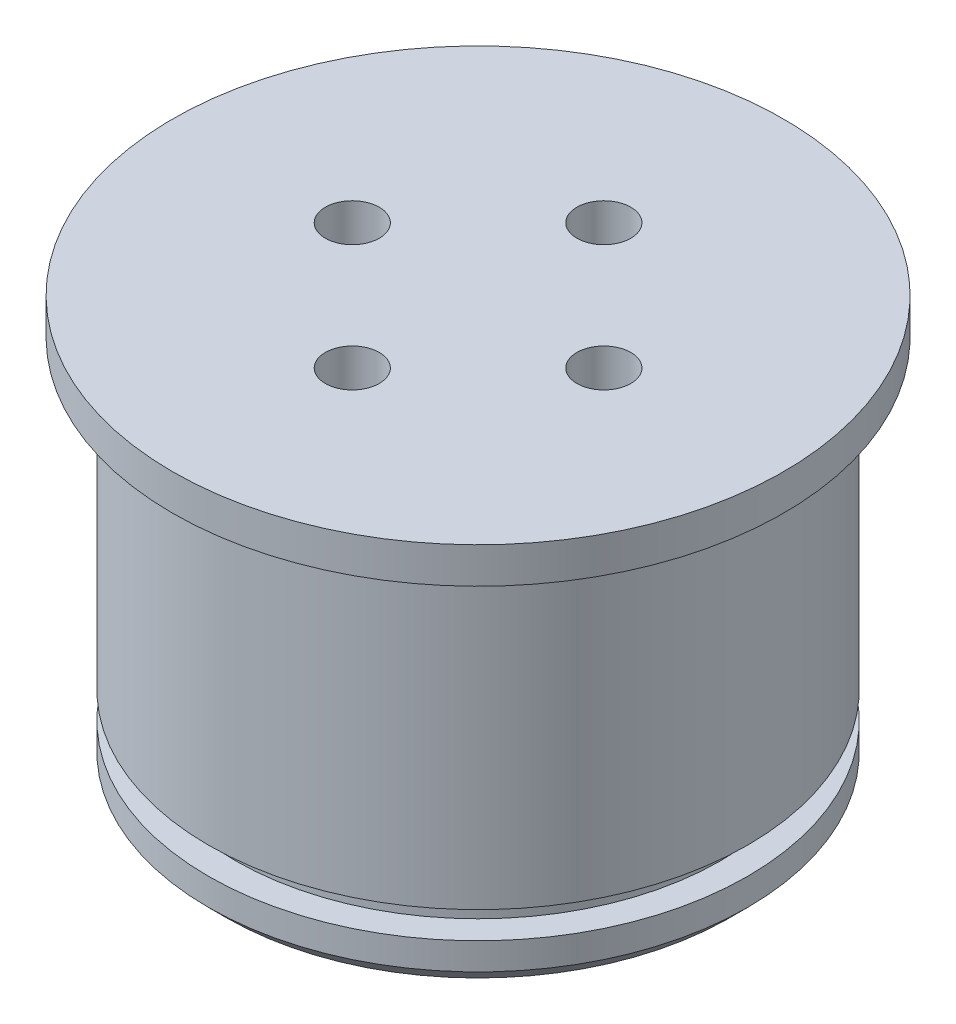
ISO-10303-21;
HEADER;
FILE_DESCRIPTION(('STEP AP214'),'2;1');
FILE_NAME('part.step','',(''),(''),'','','');
FILE_SCHEMA(('AUTOMOTIVE_DESIGN { 1 0 10303 214 1 1 1 1 }'));
ENDSEC;
DATA;
#1=APPLICATION_CONTEXT('core data for automotive mechanical design processes');
#2=APPLICATION_PROTOCOL_DEFINITION('international standard','automotive_design',2000,#1);
#3=PRODUCT_CONTEXT('',#1,'mechanical');
#4=PRODUCT('Part','Part','',(#3));
#5=PRODUCT_RELATED_PRODUCT_CATEGORY('part','',(#4));
#6=PRODUCT_DEFINITION_FORMATION('','',#4);
#7=PRODUCT_DEFINITION_CONTEXT('part definition',#1,'design');
#8=PRODUCT_DEFINITION('design','',#6,#7);
#9=PRODUCT_DEFINITION_SHAPE('','',#8);
#10=(LENGTH_UNIT() NAMED_UNIT(*) SI_UNIT(.MILLI.,.METRE.));
#11=(NAMED_UNIT(*) PLANE_ANGLE_UNIT() SI_UNIT($,.RADIAN.));
#12=(NAMED_UNIT(*) SI_UNIT($,.STERADIAN.) SOLID_ANGLE_UNIT());
#13=UNCERTAINTY_MEASURE_WITH_UNIT(LENGTH_MEASURE(1.E-05),#10,'distance_accuracy_value','');
#14=(GEOMETRIC_REPRESENTATION_CONTEXT(3) GLOBAL_UNCERTAINTY_ASSIGNED_CONTEXT((#13)) GLOBAL_UNIT_ASSIGNED_CONTEXT((#10,
#11,#12)) REPRESENTATION_CONTEXT('',''));
#15=CARTESIAN_POINT('',(0.,0.,0.));
#16=DIRECTION('',(0.,0.,1.));
#17=DIRECTION('',(1.,0.,0.));
#18=AXIS2_PLACEMENT_3D('',#15,#16,#17);
#19=CARTESIAN_POINT('',(0.,21.,0.));
#20=DIRECTION('',(0.,-1.,0.));
#21=DIRECTION('',(0.,0.,-1.));
#22=AXIS2_PLACEMENT_3D('',#19,#20,#21);
#23=CYLINDRICAL_SURFACE('',#22,15.);
#24=CARTESIAN_POINT('',(0.,1.00000000000003,0.));
#25=DIRECTION('',(0.,1.,0.));
#26=DIRECTION('',(0.,0.,1.));
#27=AXIS2_PLACEMENT_3D('',#24,#25,#26);
#28=CIRCLE('',#27,15.);
#29=CARTESIAN_POINT('',(0.,1.00000000000003,-15.));
#30=VERTEX_POINT('',#29);
#31=EDGE_CURVE('E40',#30,#30,#28,.T.);
#32=CARTESIAN_POINT('',(0.,2.5,0.));
#33=DIRECTION('',(0.,-1.,0.));
#34=DIRECTION('',(0.,0.,-1.));
#35=AXIS2_PLACEMENT_3D('',#32,#33,#34);
#36=CIRCLE('',#35,15.);
#37=CARTESIAN_POINT('',(0.,2.5,-15.));
#38=VERTEX_POINT('',#37);
#39=EDGE_CURVE('E57',#38,#38,#36,.T.);
#40=CARTESIAN_POINT('',(0.,1.00000000000003,-15.));
#41=CARTESIAN_POINT('',(0.,1.01562500000003,-15.));
#42=CARTESIAN_POINT('',(0.,1.03125000000003,-15.));
#43=CARTESIAN_POINT('',(0.,1.06250000000003,-15.));
#44=CARTESIAN_POINT('',(0.,1.07812500000003,-15.));
#45=CARTESIAN_POINT('',(0.,1.10937500000003,-15.));
#46=CARTESIAN_POINT('',(0.,1.12500000000003,-15.));
#47=CARTESIAN_POINT('',(0.,1.15625000000003,-15.));
#48=CARTESIAN_POINT('',(0.,1.17187500000003,-15.));
#49=CARTESIAN_POINT('',(0.,1.20312500000002,-15.));
#50=CARTESIAN_POINT('',(0.,1.21875000000002,-15.));
#51=CARTESIAN_POINT('',(0.,1.25000000000002,-15.));
#52=CARTESIAN_POINT('',(0.,1.26562500000002,-15.));
#53=CARTESIAN_POINT('',(0.,1.29687500000002,-15.));
#54=CARTESIAN_POINT('',(0.,1.31250000000002,-15.));
#55=CARTESIAN_POINT('',(0.,1.34375000000002,-15.));
#56=CARTESIAN_POINT('',(0.,1.35937500000002,-15.));
#57=CARTESIAN_POINT('',(0.,1.39062500000002,-15.));
#58=CARTESIAN_POINT('',(0.,1.40625000000002,-15.));
#59=CARTESIAN_POINT('',(0.,1.43750000000002,-15.));
#60=CARTESIAN_POINT('',(0.,1.45312500000002,-15.));
#61=CARTESIAN_POINT('',(0.,1.48437500000002,-15.));
#62=CARTESIAN_POINT('',(0.,1.50000000000002,-15.));
#63=CARTESIAN_POINT('',(0.,1.53125000000002,-15.));
#64=CARTESIAN_POINT('',(0.,1.54687500000002,-15.));
#65=CARTESIAN_POINT('',(0.,1.57812500000002,-15.));
#66=CARTESIAN_POINT('',(0.,1.59375000000002,-15.));
#67=CARTESIAN_POINT('',(0.,1.62500000000002,-15.));
#68=CARTESIAN_POINT('',(0.,1.64062500000002,-15.));
#69=CARTESIAN_POINT('',(0.,1.67187500000002,-15.));
#70=CARTESIAN_POINT('',(0.,1.68750000000002,-15.));
#71=CARTESIAN_POINT('',(0.,1.71875000000002,-15.));
#72=CARTESIAN_POINT('',(0.,1.73437500000002,-15.));
#73=CARTESIAN_POINT('',(0.,1.76562500000001,-15.));
#74=CARTESIAN_POINT('',(0.,1.78125000000001,-15.));
#75=CARTESIAN_POINT('',(0.,1.81250000000001,-15.));
#76=CARTESIAN_POINT('',(0.,1.82812500000001,-15.));
#77=CARTESIAN_POINT('',(0.,1.85937500000001,-15.));
#78=CARTESIAN_POINT('',(0.,1.87500000000001,-15.));
#79=CARTESIAN_POINT('',(0.,1.90625000000001,-15.));
#80=CARTESIAN_POINT('',(0.,1.92187500000001,-15.));
#81=CARTESIAN_POINT('',(0.,1.95312500000001,-15.));
#82=CARTESIAN_POINT('',(0.,1.96875000000001,-15.));
#83=CARTESIAN_POINT('',(0.,2.00000000000001,-15.));
#84=CARTESIAN_POINT('',(0.,2.01562500000001,-15.));
#85=CARTESIAN_POINT('',(0.,2.04687500000001,-15.));
#86=CARTESIAN_POINT('',(0.,2.06250000000001,-15.));
#87=CARTESIAN_POINT('',(0.,2.09375000000001,-15.));
#88=CARTESIAN_POINT('',(0.,2.10937500000001,-15.));
#89=CARTESIAN_POINT('',(0.,2.14062500000001,-15.));
#90=CARTESIAN_POINT('',(0.,2.15625000000001,-15.));
#91=CARTESIAN_POINT('',(0.,2.18750000000001,-15.));
#92=CARTESIAN_POINT('',(0.,2.20312500000001,-15.));
#93=CARTESIAN_POINT('',(0.,2.23437500000001,-15.));
#94=CARTESIAN_POINT('',(0.,2.25000000000001,-15.));
#95=CARTESIAN_POINT('',(0.,2.28125000000001,-15.));
#96=CARTESIAN_POINT('',(0.,2.29687500000001,-15.));
#97=CARTESIAN_POINT('',(0.,2.328125,-15.));
#98=CARTESIAN_POINT('',(0.,2.34375,-15.));
#99=CARTESIAN_POINT('',(0.,2.375,-15.));
#100=CARTESIAN_POINT('',(0.,2.39062500000001,-15.));
#101=CARTESIAN_POINT('',(0.,2.42187500000001,-15.));
#102=CARTESIAN_POINT('',(0.,2.4375,-15.));
#103=CARTESIAN_POINT('',(0.,2.46875,-15.));
#104=CARTESIAN_POINT('',(0.,2.484375,-15.));
#105=CARTESIAN_POINT('',(0.,2.5,-15.));
#106=B_SPLINE_CURVE_WITH_KNOTS('',3,(#40,#41,#42,#43,#44,#45,#46,#47,#48,#49,#50,#51,#52,#53,
#54,#55,#56,#57,#58,#59,#60,#61,#62,#63,#64,#65,#66,#67,#68,#69,#70,#71,#72,#73,#74,#75,#76,#77,
#78,#79,#80,#81,#82,#83,#84,#85,#86,#87,#88,#89,#90,#91,#92,#93,#94,#95,#96,#97,#98,#99,#100,
#101,#102,#103,#104,#105),.UNSPECIFIED.,.F.,.F.,(4,2,2,2,2,2,2,2,2,2,2,2,2,2,2,2,2,2,2,2,2,2,2,
2,2,2,2,2,2,2,2,2,4),(0.,0.0468749999999983,0.0937499999999966,0.140624999999998,
0.187499999999997,0.234374999999995,0.281249999999997,0.328124999999995,0.374999999999993,
0.421874999999992,0.46874999999999,0.515624999999992,0.56249999999999,0.609374999999988,
0.65624999999999,0.703124999999988,0.749999999999987,0.796874999999985,0.843749999999983,
0.890624999999985,0.937499999999983,0.984374999999982,1.03124999999998,1.07812499999998,
1.12499999999998,1.17187499999998,1.21874999999998,1.26562499999998,1.31249999999998,
1.35937499999998,1.40624999999998,1.45312499999998,1.49999999999997),.UNSPECIFIED.);
#107=EDGE_CURVE('BSEAM33',#30,#38,#106,.T.);
#108=ORIENTED_EDGE('',*,*,#31,.T.);
#109=ORIENTED_EDGE('',*,*,#39,.T.);
#110=ORIENTED_EDGE('',*,*,#107,.T.);
#111=ORIENTED_EDGE('',*,*,#107,.F.);
#112=EDGE_LOOP('',(#108,#110,#109,#111));
#113=FACE_BOUND('',#112,.T.);
#114=ADVANCED_FACE('F33',(#113),#23,.T.);
#115=CARTESIAN_POINT('',(0.,0.,0.));
#116=DIRECTION('',(0.,1.,0.));
#117=DIRECTION('',(0.,0.,1.));
#118=AXIS2_PLACEMENT_3D('',#115,#116,#117);
#119=PLANE('',#118);
#120=CARTESIAN_POINT('',(0.,0.,0.));
#121=DIRECTION('',(0.,1.,0.));
#122=DIRECTION('',(0.,0.,1.));
#123=AXIS2_PLACEMENT_3D('',#120,#121,#122);
#124=CIRCLE('',#123,14.);
#125=CARTESIAN_POINT('',(0.,0.,14.));
#126=VERTEX_POINT('',#125);
#127=EDGE_CURVE('E10',#126,#126,#124,.F.);
#128=ORIENTED_EDGE('',*,*,#127,.T.);
#129=EDGE_LOOP('',(#128));
#130=FACE_BOUND('',#129,.T.);
#131=CARTESIAN_POINT('',(0.,0.,0.));
#132=DIRECTION('',(0.,-1.,0.));
#133=DIRECTION('',(0.,0.,-1.));
#134=AXIS2_PLACEMENT_3D('',#131,#132,#133);
#135=CIRCLE('',#134,10.);
#136=CARTESIAN_POINT('',(0.,0.,-10.));
#137=VERTEX_POINT('',#136);
#138=EDGE_CURVE('E51',#137,#137,#135,.T.);
#139=ORIENTED_EDGE('',*,*,#138,.F.);
#140=EDGE_LOOP('',(#139));
#141=FACE_BOUND('',#140,.T.);
#142=ADVANCED_FACE('F125',(#130,#141),#119,.F.);
#143=CARTESIAN_POINT('',(0.,2.5,0.));
#144=DIRECTION('',(0.,-1.,0.));
#145=DIRECTION('',(0.,0.,-1.));
#146=AXIS2_PLACEMENT_3D('',#143,#144,#145);
#147=CYLINDRICAL_SURFACE('',#146,10.);
#148=CARTESIAN_POINT('',(0.,2.5,0.));
#149=DIRECTION('',(0.,-1.,0.));
#150=DIRECTION('',(0.,0.,-1.));
#151=AXIS2_PLACEMENT_3D('',#148,#149,#150);
#152=CIRCLE('',#151,10.);
#153=CARTESIAN_POINT('',(0.,2.5,-10.));
#154=VERTEX_POINT('',#153);
#155=EDGE_CURVE('E48',#154,#154,#152,.T.);
#156=ORIENTED_EDGE('',*,*,#155,.F.);
#157=EDGE_LOOP('',(#156));
#158=FACE_BOUND('',#157,.T.);
#159=ORIENTED_EDGE('',*,*,#138,.T.);
#160=EDGE_LOOP('',(#159));
#161=FACE_BOUND('',#160,.T.);
#162=ADVANCED_FACE('F113',(#158,#161),#147,.F.);
#163=CARTESIAN_POINT('',(0.,2.5,0.));
#164=DIRECTION('',(0.,-1.,0.));
#165=DIRECTION('',(0.,0.,-1.));
#166=AXIS2_PLACEMENT_3D('',#163,#164,#165);
#167=PLANE('',#166);
#168=CARTESIAN_POINT('',(7.,2.5,0.));
#169=DIRECTION('',(0.,-1.,0.));
#170=DIRECTION('',(-1.,0.,0.));
#171=AXIS2_PLACEMENT_3D('',#168,#169,#170);
#172=CIRCLE('',#171,1.5);
#173=CARTESIAN_POINT('',(5.5,2.5,0.));
#174=VERTEX_POINT('',#173);
#175=EDGE_CURVE('E93',#174,#174,#172,.T.);
#176=ORIENTED_EDGE('',*,*,#175,.F.);
#177=EDGE_LOOP('',(#176));
#178=FACE_BOUND('',#177,.T.);
#179=CARTESIAN_POINT('',(0.,2.5,-7.));
#180=DIRECTION('',(0.,-1.,0.));
#181=DIRECTION('',(0.,0.,1.));
#182=AXIS2_PLACEMENT_3D('',#179,#180,#181);
#183=CIRCLE('',#182,1.5);
#184=CARTESIAN_POINT('',(0.,2.5,-5.5));
#185=VERTEX_POINT('',#184);
#186=EDGE_CURVE('E87',#185,#185,#183,.T.);
#187=ORIENTED_EDGE('',*,*,#186,.F.);
#188=EDGE_LOOP('',(#187));
#189=FACE_BOUND('',#188,.T.);
#190=CARTESIAN_POINT('',(-7.,2.5,0.));
#191=DIRECTION('',(0.,-1.,0.));
#192=DIRECTION('',(1.,0.,0.));
#193=AXIS2_PLACEMENT_3D('',#190,#191,#192);
#194=CIRCLE('',#193,1.5);
#195=CARTESIAN_POINT('',(-5.5,2.5,0.));
#196=VERTEX_POINT('',#195);
#197=EDGE_CURVE('E81',#196,#196,#194,.T.);
#198=ORIENTED_EDGE('',*,*,#197,.F.);
#199=EDGE_LOOP('',(#198));
#200=FACE_BOUND('',#199,.T.);
#201=CARTESIAN_POINT('',(0.,2.5,7.));
#202=DIRECTION('',(0.,-1.,0.));
#203=DIRECTION('',(0.,0.,-1.));
#204=AXIS2_PLACEMENT_3D('',#201,#202,#203);
#205=CIRCLE('',#204,1.5);
#206=CARTESIAN_POINT('',(0.,2.5,5.5));
#207=VERTEX_POINT('',#206);
#208=EDGE_CURVE('E75',#207,#207,#205,.T.);
#209=ORIENTED_EDGE('',*,*,#208,.F.);
#210=EDGE_LOOP('',(#209));
#211=FACE_BOUND('',#210,.T.);
#212=ORIENTED_EDGE('',*,*,#155,.T.);
#213=EDGE_LOOP('',(#212));
#214=FACE_BOUND('',#213,.T.);
#215=ADVANCED_FACE('F109',(#178,#189,#200,#211,#214),#167,.T.);
#216=CARTESIAN_POINT('',(0.,4.,0.));
#217=DIRECTION('',(0.,-1.,0.));
#218=DIRECTION('',(0.,0.,-1.));
#219=AXIS2_PLACEMENT_3D('',#216,#217,#218);
#220=PLANE('',#219);
#221=CARTESIAN_POINT('',(0.,4.,0.));
#222=DIRECTION('',(0.,-1.,0.));
#223=DIRECTION('',(0.,0.,-1.));
#224=AXIS2_PLACEMENT_3D('',#221,#222,#223);
#225=CIRCLE('',#224,13.5);
#226=CARTESIAN_POINT('',(0.,4.,-13.5));
#227=VERTEX_POINT('',#226);
#228=EDGE_CURVE('E60',#227,#227,#225,.T.);
#229=ORIENTED_EDGE('',*,*,#228,.F.);
#230=EDGE_LOOP('',(#229));
#231=FACE_BOUND('',#230,.T.);
#232=CARTESIAN_POINT('',(0.,4.,0.));
#233=DIRECTION('',(0.,-1.,0.));
#234=DIRECTION('',(0.,0.,-1.));
#235=AXIS2_PLACEMENT_3D('',#232,#233,#234);
#236=CIRCLE('',#235,15.);
#237=CARTESIAN_POINT('',(0.,4.,-15.));
#238=VERTEX_POINT('',#237);
#239=EDGE_CURVE('E54',#238,#238,#236,.T.);
#240=ORIENTED_EDGE('',*,*,#239,.T.);
#241=EDGE_LOOP('',(#240));
#242=FACE_BOUND('',#241,.T.);
#243=ADVANCED_FACE('F112',(#231,#242),#220,.T.);
#244=CARTESIAN_POINT('',(0.,2.5,0.));
#245=DIRECTION('',(0.,-1.,0.));
#246=DIRECTION('',(0.,0.,-1.));
#247=AXIS2_PLACEMENT_3D('',#244,#245,#246);
#248=PLANE('',#247);
#249=CARTESIAN_POINT('',(0.,2.5,0.));
#250=DIRECTION('',(0.,-1.,0.));
#251=DIRECTION('',(0.,0.,-1.));
#252=AXIS2_PLACEMENT_3D('',#249,#250,#251);
#253=CIRCLE('',#252,13.5);
#254=CARTESIAN_POINT('',(0.,2.5,-13.5));
#255=VERTEX_POINT('',#254);
#256=EDGE_CURVE('E63',#255,#255,#253,.T.);
#257=ORIENTED_EDGE('',*,*,#256,.T.);
#258=EDGE_LOOP('',(#257));
#259=FACE_BOUND('',#258,.T.);
#260=ORIENTED_EDGE('',*,*,#39,.F.);
#261=EDGE_LOOP('',(#260));
#262=FACE_BOUND('',#261,.T.);
#263=ADVANCED_FACE('F136',(#259,#262),#248,.F.);
#264=CARTESIAN_POINT('',(0.,4.,0.));
#265=DIRECTION('',(0.,-1.,0.));
#266=DIRECTION('',(0.,0.,-1.));
#267=AXIS2_PLACEMENT_3D('',#264,#265,#266);
#268=CYLINDRICAL_SURFACE('',#267,13.5);
#269=ORIENTED_EDGE('',*,*,#228,.T.);
#270=EDGE_LOOP('',(#269));
#271=FACE_BOUND('',#270,.T.);
#272=ORIENTED_EDGE('',*,*,#256,.F.);
#273=EDGE_LOOP('',(#272));
#274=FACE_BOUND('',#273,.T.);
#275=ADVANCED_FACE('F139',(#271,#274),#268,.T.);
#276=CARTESIAN_POINT('',(0.,21.,0.));
#277=DIRECTION('',(0.,1.,0.));
#278=DIRECTION('',(0.,0.,1.));
#279=AXIS2_PLACEMENT_3D('',#276,#277,#278);
#280=CIRCLE('',#279,15.);
#281=CARTESIAN_POINT('',(0.,21.,-15.));
#282=VERTEX_POINT('',#281);
#283=EDGE_CURVE('E44',#282,#282,#280,.T.);
#284=CARTESIAN_POINT('',(0.,21.,-15.));
#285=CARTESIAN_POINT('',(0.,20.8229166666667,-15.));
#286=CARTESIAN_POINT('',(0.,20.6458333333333,-15.));
#287=CARTESIAN_POINT('',(0.,20.2916666666667,-15.));
#288=CARTESIAN_POINT('',(0.,20.1145833333333,-15.));
#289=CARTESIAN_POINT('',(0.,19.7604166666667,-15.));
#290=CARTESIAN_POINT('',(0.,19.5833333333333,-15.));
#291=CARTESIAN_POINT('',(0.,19.2291666666667,-15.));
#292=CARTESIAN_POINT('',(0.,19.0520833333333,-15.));
#293=CARTESIAN_POINT('',(0.,18.6979166666667,-15.));
#294=CARTESIAN_POINT('',(0.,18.5208333333333,-15.));
#295=CARTESIAN_POINT('',(0.,18.1666666666667,-15.));
#296=CARTESIAN_POINT('',(0.,17.9895833333333,-15.));
#297=CARTESIAN_POINT('',(0.,17.6354166666667,-15.));
#298=CARTESIAN_POINT('',(0.,17.4583333333333,-15.));
#299=CARTESIAN_POINT('',(0.,17.1041666666667,-15.));
#300=CARTESIAN_POINT('',(0.,16.9270833333333,-15.));
#301=CARTESIAN_POINT('',(0.,16.5729166666667,-15.));
#302=CARTESIAN_POINT('',(0.,16.3958333333333,-15.));
#303=CARTESIAN_POINT('',(0.,16.0416666666667,-15.));
#304=CARTESIAN_POINT('',(0.,15.8645833333333,-15.));
#305=CARTESIAN_POINT('',(0.,15.5104166666667,-15.));
#306=CARTESIAN_POINT('',(0.,15.3333333333333,-15.));
#307=CARTESIAN_POINT('',(0.,14.9791666666667,-15.));
#308=CARTESIAN_POINT('',(0.,14.8020833333333,-15.));
#309=CARTESIAN_POINT('',(0.,14.4479166666667,-15.));
#310=CARTESIAN_POINT('',(0.,14.2708333333333,-15.));
#311=CARTESIAN_POINT('',(0.,13.9166666666667,-15.));
#312=CARTESIAN_POINT('',(0.,13.7395833333333,-15.));
#313=CARTESIAN_POINT('',(0.,13.3854166666667,-15.));
#314=CARTESIAN_POINT('',(0.,13.2083333333333,-15.));
#315=CARTESIAN_POINT('',(0.,12.8541666666667,-15.));
#316=CARTESIAN_POINT('',(0.,12.6770833333333,-15.));
#317=CARTESIAN_POINT('',(0.,12.3229166666667,-15.));
#318=CARTESIAN_POINT('',(0.,12.1458333333333,-15.));
#319=CARTESIAN_POINT('',(0.,11.7916666666667,-15.));
#320=CARTESIAN_POINT('',(0.,11.6145833333333,-15.));
#321=CARTESIAN_POINT('',(0.,11.2604166666667,-15.));
#322=CARTESIAN_POINT('',(0.,11.0833333333333,-15.));
#323=CARTESIAN_POINT('',(0.,10.7291666666667,-15.));
#324=CARTESIAN_POINT('',(0.,10.5520833333333,-15.));
#325=CARTESIAN_POINT('',(0.,10.1979166666667,-15.));
#326=CARTESIAN_POINT('',(0.,10.0208333333333,-15.));
#327=CARTESIAN_POINT('',(0.,9.66666666666667,-15.));
#328=CARTESIAN_POINT('',(0.,9.48958333333334,-15.));
#329=CARTESIAN_POINT('',(0.,9.13541666666667,-15.));
#330=CARTESIAN_POINT('',(0.,8.95833333333334,-15.));
#331=CARTESIAN_POINT('',(0.,8.60416666666667,-15.));
#332=CARTESIAN_POINT('',(0.,8.42708333333334,-15.));
#333=CARTESIAN_POINT('',(0.,8.07291666666667,-15.));
#334=CARTESIAN_POINT('',(0.,7.89583333333334,-15.));
#335=CARTESIAN_POINT('',(0.,7.54166666666667,-15.));
#336=CARTESIAN_POINT('',(0.,7.36458333333334,-15.));
#337=CARTESIAN_POINT('',(0.,7.01041666666667,-15.));
#338=CARTESIAN_POINT('',(0.,6.83333333333334,-15.));
#339=CARTESIAN_POINT('',(0.,6.47916666666667,-15.));
#340=CARTESIAN_POINT('',(0.,6.30208333333334,-15.));
#341=CARTESIAN_POINT('',(0.,5.94791666666667,-15.));
#342=CARTESIAN_POINT('',(0.,5.77083333333334,-15.));
#343=CARTESIAN_POINT('',(0.,5.41666666666667,-15.));
#344=CARTESIAN_POINT('',(0.,5.23958333333334,-15.));
#345=CARTESIAN_POINT('',(0.,4.88541666666667,-15.));
#346=CARTESIAN_POINT('',(0.,4.70833333333334,-15.));
#347=CARTESIAN_POINT('',(0.,4.35416666666667,-15.));
#348=CARTESIAN_POINT('',(0.,4.17708333333334,-15.));
#349=CARTESIAN_POINT('',(0.,4.,-15.));
#350=B_SPLINE_CURVE_WITH_KNOTS('',3,(#284,#285,#286,#287,#288,#289,#290,#291,#292,#293,#294,
#295,#296,#297,#298,#299,#300,#301,#302,#303,#304,#305,#306,#307,#308,#309,#310,#311,#312,#313,
#314,#315,#316,#317,#318,#319,#320,#321,#322,#323,#324,#325,#326,#327,#328,#329,#330,#331,#332,
#333,#334,#335,#336,#337,#338,#339,#340,#341,#342,#343,#344,#345,#346,#347,#348,#349),
.UNSPECIFIED.,.F.,.F.,(4,2,2,2,2,2,2,2,2,2,2,2,2,2,2,2,2,2,2,2,2,2,2,2,2,2,2,2,2,2,2,2,4),(0.,
0.531249999999997,1.0625,1.59375,2.125,2.65625,3.1875,3.71875,4.25,4.78125,5.3125,5.84375,6.375,
6.90625,7.4375,7.96874999999999,8.49999999999999,9.03125,9.56249999999999,10.09375,10.625,
11.15625,11.6875,12.21875,12.75,13.28125,13.8125,14.34375,14.875,15.40625,15.9375,16.46875,17.),.UNSPECIFIED.);
#351=EDGE_CURVE('BSEAM134',#282,#238,#350,.T.);
#352=ORIENTED_EDGE('',*,*,#283,.F.);
#353=ORIENTED_EDGE('',*,*,#239,.F.);
#354=ORIENTED_EDGE('',*,*,#351,.T.);
#355=ORIENTED_EDGE('',*,*,#351,.F.);
#356=EDGE_LOOP('',(#352,#354,#353,#355));
#357=FACE_BOUND('',#356,.T.);
#358=ADVANCED_FACE('F134',(#357),#23,.T.);
#359=CARTESIAN_POINT('',(0.,1.00000000000003,0.));
#360=DIRECTION('',(0.,1.,0.));
#361=DIRECTION('',(0.,0.,1.));
#362=AXIS2_PLACEMENT_3D('',#359,#360,#361);
#363=CONICAL_SURFACE('',#362,15.,0.785398163397449);
#364=ORIENTED_EDGE('',*,*,#127,.F.);
#365=EDGE_LOOP('',(#364));
#366=FACE_BOUND('',#365,.T.);
#367=ORIENTED_EDGE('',*,*,#31,.F.);
#368=EDGE_LOOP('',(#367));
#369=FACE_BOUND('',#368,.T.);
#370=ADVANCED_FACE('F35',(#366,#369),#363,.T.);
#371=CARTESIAN_POINT('',(0.,23.,0.));
#372=DIRECTION('',(0.,-1.,0.));
#373=DIRECTION('',(0.,0.,-1.));
#374=AXIS2_PLACEMENT_3D('',#371,#372,#373);
#375=CYLINDRICAL_SURFACE('',#374,17.);
#376=CARTESIAN_POINT('',(0.,23.,0.));
#377=DIRECTION('',(0.,1.,0.));
#378=DIRECTION('',(0.,0.,1.));
#379=AXIS2_PLACEMENT_3D('',#376,#377,#378);
#380=CIRCLE('',#379,17.);
#381=CARTESIAN_POINT('',(0.,23.,17.));
#382=VERTEX_POINT('',#381);
#383=EDGE_CURVE('E66',#382,#382,#380,.T.);
#384=ORIENTED_EDGE('',*,*,#383,.F.);
#385=EDGE_LOOP('',(#384));
#386=FACE_BOUND('',#385,.T.);
#387=CARTESIAN_POINT('',(0.,21.,0.));
#388=DIRECTION('',(0.,1.,0.));
#389=DIRECTION('',(0.,0.,1.));
#390=AXIS2_PLACEMENT_3D('',#387,#388,#389);
#391=CIRCLE('',#390,17.);
#392=CARTESIAN_POINT('',(0.,21.,17.));
#393=VERTEX_POINT('',#392);
#394=EDGE_CURVE('E69',#393,#393,#391,.T.);
#395=ORIENTED_EDGE('',*,*,#394,.T.);
#396=EDGE_LOOP('',(#395));
#397=FACE_BOUND('',#396,.T.);
#398=ADVANCED_FACE('F147',(#386,#397),#375,.T.);
#399=CARTESIAN_POINT('',(0.,23.,0.));
#400=DIRECTION('',(0.,1.,0.));
#401=DIRECTION('',(0.,0.,1.));
#402=AXIS2_PLACEMENT_3D('',#399,#400,#401);
#403=PLANE('',#402);
#404=CARTESIAN_POINT('',(7.,23.,0.));
#405=DIRECTION('',(0.,-1.,0.));
#406=DIRECTION('',(-1.,0.,0.));
#407=AXIS2_PLACEMENT_3D('',#404,#405,#406);
#408=CIRCLE('',#407,1.5);
#409=CARTESIAN_POINT('',(5.5,23.,0.));
#410=VERTEX_POINT('',#409);
#411=EDGE_CURVE('E78',#410,#410,#408,.T.);
#412=ORIENTED_EDGE('',*,*,#411,.T.);
#413=EDGE_LOOP('',(#412));
#414=FACE_BOUND('',#413,.T.);
#415=CARTESIAN_POINT('',(0.,23.,-7.));
#416=DIRECTION('',(0.,-1.,0.));
#417=DIRECTION('',(0.,0.,1.));
#418=AXIS2_PLACEMENT_3D('',#415,#416,#417);
#419=CIRCLE('',#418,1.5);
#420=CARTESIAN_POINT('',(0.,23.,-5.5));
#421=VERTEX_POINT('',#420);
#422=EDGE_CURVE('E90',#421,#421,#419,.T.);
#423=ORIENTED_EDGE('',*,*,#422,.T.);
#424=EDGE_LOOP('',(#423));
#425=FACE_BOUND('',#424,.T.);
#426=CARTESIAN_POINT('',(-7.,23.,0.));
#427=DIRECTION('',(0.,-1.,0.));
#428=DIRECTION('',(1.,0.,0.));
#429=AXIS2_PLACEMENT_3D('',#426,#427,#428);
#430=CIRCLE('',#429,1.5);
#431=CARTESIAN_POINT('',(-5.5,23.,0.));
#432=VERTEX_POINT('',#431);
#433=EDGE_CURVE('E84',#432,#432,#430,.T.);
#434=ORIENTED_EDGE('',*,*,#433,.T.);
#435=EDGE_LOOP('',(#434));
#436=FACE_BOUND('',#435,.T.);
#437=CARTESIAN_POINT('',(0.,23.,7.));
#438=DIRECTION('',(0.,-1.,0.));
#439=DIRECTION('',(0.,0.,-1.));
#440=AXIS2_PLACEMENT_3D('',#437,#438,#439);
#441=CIRCLE('',#440,1.5);
#442=CARTESIAN_POINT('',(0.,23.,5.5));
#443=VERTEX_POINT('',#442);
#444=EDGE_CURVE('E72',#443,#443,#441,.T.);
#445=ORIENTED_EDGE('',*,*,#444,.T.);
#446=EDGE_LOOP('',(#445));
#447=FACE_BOUND('',#446,.T.);
#448=ORIENTED_EDGE('',*,*,#383,.T.);
#449=EDGE_LOOP('',(#448));
#450=FACE_BOUND('',#449,.T.);
#451=ADVANCED_FACE('F99',(#414,#425,#436,#447,#450),#403,.T.);
#452=CARTESIAN_POINT('',(0.,21.,0.));
#453=DIRECTION('',(0.,1.,0.));
#454=DIRECTION('',(0.,0.,1.));
#455=AXIS2_PLACEMENT_3D('',#452,#453,#454);
#456=PLANE('',#455);
#457=ORIENTED_EDGE('',*,*,#283,.T.);
#458=EDGE_LOOP('',(#457));
#459=FACE_BOUND('',#458,.T.);
#460=ORIENTED_EDGE('',*,*,#394,.F.);
#461=EDGE_LOOP('',(#460));
#462=FACE_BOUND('',#461,.T.);
#463=ADVANCED_FACE('F151',(#459,#462),#456,.F.);
#464=CARTESIAN_POINT('',(0.,23.,7.));
#465=DIRECTION('',(0.,-1.,0.));
#466=DIRECTION('',(0.,0.,-1.));
#467=AXIS2_PLACEMENT_3D('',#464,#465,#466);
#468=CYLINDRICAL_SURFACE('',#467,1.5);
#469=ORIENTED_EDGE('',*,*,#444,.F.);
#470=EDGE_LOOP('',(#469));
#471=FACE_BOUND('',#470,.T.);
#472=ORIENTED_EDGE('',*,*,#208,.T.);
#473=EDGE_LOOP('',(#472));
#474=FACE_BOUND('',#473,.T.);
#475=ADVANCED_FACE('F154',(#471,#474),#468,.F.);
#476=CARTESIAN_POINT('',(-7.,23.,0.));
#477=DIRECTION('',(0.,-1.,0.));
#478=DIRECTION('',(0.,0.,-1.));
#479=AXIS2_PLACEMENT_3D('',#476,#477,#478);
#480=CYLINDRICAL_SURFACE('',#479,1.5);
#481=ORIENTED_EDGE('',*,*,#433,.F.);
#482=EDGE_LOOP('',(#481));
#483=FACE_BOUND('',#482,.T.);
#484=ORIENTED_EDGE('',*,*,#197,.T.);
#485=EDGE_LOOP('',(#484));
#486=FACE_BOUND('',#485,.T.);
#487=ADVANCED_FACE('F160',(#483,#486),#480,.F.);
#488=CARTESIAN_POINT('',(0.,23.,-7.));
#489=DIRECTION('',(0.,-1.,0.));
#490=DIRECTION('',(0.,0.,-1.));
#491=AXIS2_PLACEMENT_3D('',#488,#489,#490);
#492=CYLINDRICAL_SURFACE('',#491,1.5);
#493=ORIENTED_EDGE('',*,*,#422,.F.);
#494=EDGE_LOOP('',(#493));
#495=FACE_BOUND('',#494,.T.);
#496=ORIENTED_EDGE('',*,*,#186,.T.);
#497=EDGE_LOOP('',(#496));
#498=FACE_BOUND('',#497,.T.);
#499=ADVANCED_FACE('F105',(#495,#498),#492,.F.);
#500=CARTESIAN_POINT('',(7.,23.,0.));
#501=DIRECTION('',(0.,-1.,0.));
#502=DIRECTION('',(0.,0.,-1.));
#503=AXIS2_PLACEMENT_3D('',#500,#501,#502);
#504=CYLINDRICAL_SURFACE('',#503,1.5);
#505=ORIENTED_EDGE('',*,*,#411,.F.);
#506=EDGE_LOOP('',(#505));
#507=FACE_BOUND('',#506,.T.);
#508=ORIENTED_EDGE('',*,*,#175,.T.);
#509=EDGE_LOOP('',(#508));
#510=FACE_BOUND('',#509,.T.);
#511=ADVANCED_FACE('F102',(#507,#510),#504,.F.);
#512=CLOSED_SHELL('',(#114,#142,#162,#215,#243,#263,#275,#358,#370,#398,#451,#463,#475,#487,
#499,#511));
#513=MANIFOLD_SOLID_BREP('B2',#512);
#514=ADVANCED_BREP_SHAPE_REPRESENTATION('',(#18,#513),#14);
#515=SHAPE_DEFINITION_REPRESENTATION(#9,#514);
ENDSEC;
END-ISO-10303-21;
